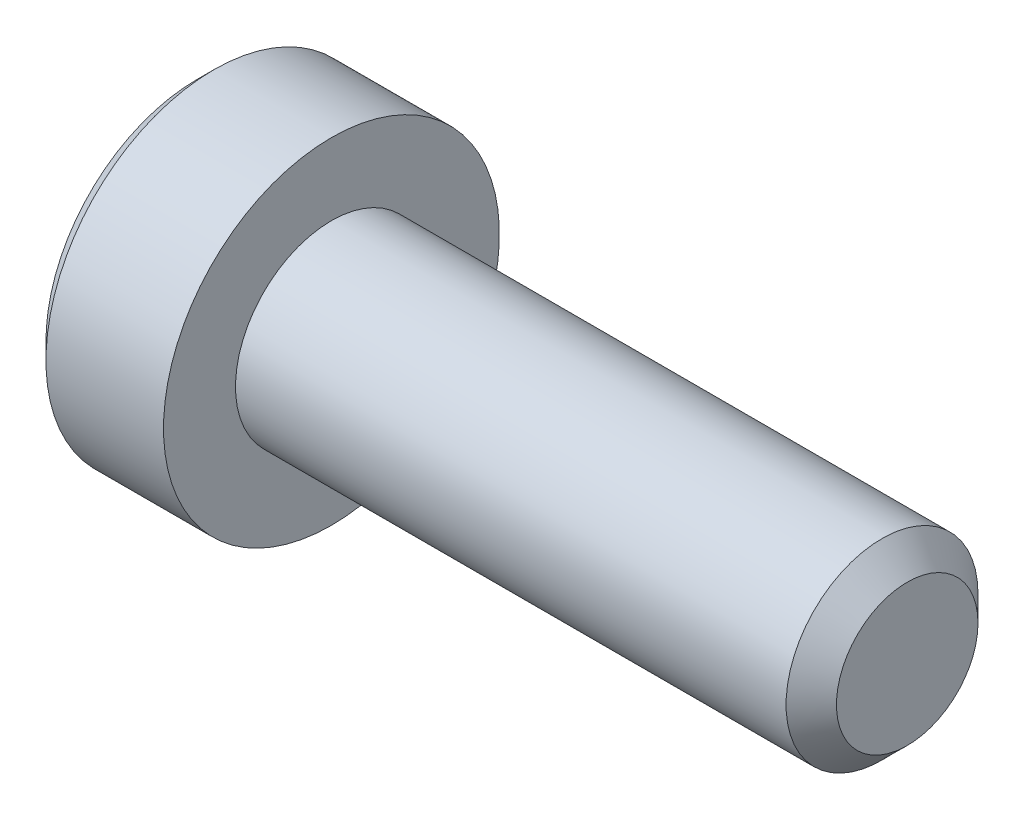
ISO-10303-21;
HEADER;
FILE_DESCRIPTION(('STEP AP214'),'2;1');
FILE_NAME('part.step','',(''),(''),'','','');
FILE_SCHEMA(('AUTOMOTIVE_DESIGN { 1 0 10303 214 1 1 1 1 }'));
ENDSEC;
DATA;
#1=APPLICATION_CONTEXT('core data for automotive mechanical design processes');
#2=APPLICATION_PROTOCOL_DEFINITION('international standard','automotive_design',2000,#1);
#3=PRODUCT_CONTEXT('',#1,'mechanical');
#4=PRODUCT('Part','Part','',(#3));
#5=PRODUCT_RELATED_PRODUCT_CATEGORY('part','',(#4));
#6=PRODUCT_DEFINITION_FORMATION('','',#4);
#7=PRODUCT_DEFINITION_CONTEXT('part definition',#1,'design');
#8=PRODUCT_DEFINITION('design','',#6,#7);
#9=PRODUCT_DEFINITION_SHAPE('','',#8);
#10=(LENGTH_UNIT() NAMED_UNIT(*) SI_UNIT(.MILLI.,.METRE.));
#11=(NAMED_UNIT(*) PLANE_ANGLE_UNIT() SI_UNIT($,.RADIAN.));
#12=(NAMED_UNIT(*) SI_UNIT($,.STERADIAN.) SOLID_ANGLE_UNIT());
#13=UNCERTAINTY_MEASURE_WITH_UNIT(LENGTH_MEASURE(1.E-05),#10,'distance_accuracy_value','');
#14=(GEOMETRIC_REPRESENTATION_CONTEXT(3) GLOBAL_UNCERTAINTY_ASSIGNED_CONTEXT((#13)) GLOBAL_UNIT_ASSIGNED_CONTEXT((#10,
#11,#12)) REPRESENTATION_CONTEXT('',''));
#15=CARTESIAN_POINT('',(0.,0.,0.));
#16=DIRECTION('',(0.,0.,1.));
#17=DIRECTION('',(1.,0.,0.));
#18=AXIS2_PLACEMENT_3D('',#15,#16,#17);
#19=CARTESIAN_POINT('',(-8.8,3.15,0.));
#20=DIRECTION('',(-1.,0.,0.));
#21=DIRECTION('',(0.,-1.,0.));
#22=AXIS2_PLACEMENT_3D('',#19,#20,#21);
#23=PLANE('',#22);
#24=CARTESIAN_POINT('',(-8.8,0.,0.));
#25=DIRECTION('',(-1.,0.,0.));
#26=DIRECTION('',(0.,-1.,0.));
#27=AXIS2_PLACEMENT_3D('',#24,#25,#26);
#28=CIRCLE('',#27,1.44337567297401);
#29=CARTESIAN_POINT('',(-8.80000000000001,-1.44337567297399,-1.28261117005035E-13));
#30=VERTEX_POINT('',#29);
#31=CARTESIAN_POINT('',(-8.80000000000001,-0.721687836487094,1.24999999999989));
#32=VERTEX_POINT('',#31);
#33=EDGE_CURVE('E138',#30,#32,#28,.T.);
#34=ORIENTED_EDGE('',*,*,#33,.F.);
#35=CARTESIAN_POINT('',(-8.8,-0.721687836487033,-1.25));
#36=VERTEX_POINT('',#35);
#37=EDGE_CURVE('E137',#36,#30,#28,.T.);
#38=ORIENTED_EDGE('',*,*,#37,.F.);
#39=CARTESIAN_POINT('',(-8.8,0.721687836486959,-1.25));
#40=VERTEX_POINT('',#39);
#41=EDGE_CURVE('E107',#40,#36,#28,.T.);
#42=ORIENTED_EDGE('',*,*,#41,.F.);
#43=CARTESIAN_POINT('',(-8.8,1.44337567297404,0.));
#44=VERTEX_POINT('',#43);
#45=EDGE_CURVE('E100',#44,#40,#28,.T.);
#46=ORIENTED_EDGE('',*,*,#45,.F.);
#47=CARTESIAN_POINT('',(-8.8,0.721687836486958,1.25));
#48=VERTEX_POINT('',#47);
#49=EDGE_CURVE('E61',#48,#44,#28,.T.);
#50=ORIENTED_EDGE('',*,*,#49,.F.);
#51=EDGE_CURVE('E68',#32,#48,#28,.T.);
#52=ORIENTED_EDGE('',*,*,#51,.F.);
#53=EDGE_LOOP('',(#34,#38,#42,#46,#50,#52));
#54=FACE_BOUND('',#53,.T.);
#55=CARTESIAN_POINT('',(-8.8,0.,0.));
#56=DIRECTION('',(1.,0.,0.));
#57=DIRECTION('',(0.,1.,0.));
#58=AXIS2_PLACEMENT_3D('',#55,#56,#57);
#59=CIRCLE('',#58,3.15);
#60=CARTESIAN_POINT('',(-8.8,3.15,0.));
#61=VERTEX_POINT('',#60);
#62=EDGE_CURVE('E227',#61,#61,#59,.T.);
#63=ORIENTED_EDGE('',*,*,#62,.F.);
#64=EDGE_LOOP('',(#63));
#65=FACE_BOUND('',#64,.T.);
#66=ADVANCED_FACE('F41',(#54,#65),#23,.T.);
#67=CARTESIAN_POINT('',(-6.,0.,0.));
#68=DIRECTION('',(1.,0.,0.));
#69=DIRECTION('',(0.,0.,-1.));
#70=AXIS2_PLACEMENT_3D('',#67,#68,#69);
#71=CYLINDRICAL_SURFACE('',#70,2.);
#72=CARTESIAN_POINT('',(5.475,0.,0.));
#73=DIRECTION('',(1.,0.,0.));
#74=DIRECTION('',(0.,0.,-1.));
#75=AXIS2_PLACEMENT_3D('',#72,#73,#74);
#76=CIRCLE('',#75,2.);
#77=CARTESIAN_POINT('',(5.475,0.,-2.));
#78=VERTEX_POINT('',#77);
#79=EDGE_CURVE('E55',#78,#78,#76,.F.);
#80=ORIENTED_EDGE('',*,*,#79,.T.);
#81=EDGE_LOOP('',(#80));
#82=FACE_BOUND('',#81,.T.);
#83=CARTESIAN_POINT('',(-6.,0.,0.));
#84=DIRECTION('',(1.,0.,0.));
#85=DIRECTION('',(0.,1.,0.));
#86=AXIS2_PLACEMENT_3D('',#83,#84,#85);
#87=CIRCLE('',#86,2.);
#88=CARTESIAN_POINT('',(-6.,1.99999999999999,0.));
#89=VERTEX_POINT('',#88);
#90=EDGE_CURVE('E220',#89,#89,#87,.F.);
#91=ORIENTED_EDGE('',*,*,#90,.F.);
#92=EDGE_LOOP('',(#91));
#93=FACE_BOUND('',#92,.T.);
#94=ADVANCED_FACE('F200',(#82,#93),#71,.T.);
#95=CARTESIAN_POINT('',(6.,0.,0.));
#96=DIRECTION('',(1.,0.,0.));
#97=DIRECTION('',(0.,0.,-1.));
#98=AXIS2_PLACEMENT_3D('',#95,#96,#97);
#99=PLANE('',#98);
#100=CARTESIAN_POINT('',(6.,0.,0.));
#101=DIRECTION('',(1.,0.,0.));
#102=DIRECTION('',(0.,0.,-1.));
#103=AXIS2_PLACEMENT_3D('',#100,#101,#102);
#104=CIRCLE('',#103,1.475);
#105=CARTESIAN_POINT('',(6.,0.,-1.475));
#106=VERTEX_POINT('',#105);
#107=EDGE_CURVE('E221',#106,#106,#104,.T.);
#108=ORIENTED_EDGE('',*,*,#107,.T.);
#109=EDGE_LOOP('',(#108));
#110=FACE_BOUND('',#109,.T.);
#111=ADVANCED_FACE('F208',(#110),#99,.T.);
#112=CARTESIAN_POINT('',(6.,0.,0.));
#113=DIRECTION('',(-1.,0.,0.));
#114=DIRECTION('',(0.,0.,1.));
#115=AXIS2_PLACEMENT_3D('',#112,#113,#114);
#116=CONICAL_SURFACE('',#115,1.475,0.785398163397447);
#117=ORIENTED_EDGE('',*,*,#79,.F.);
#118=EDGE_LOOP('',(#117));
#119=FACE_BOUND('',#118,.T.);
#120=ORIENTED_EDGE('',*,*,#107,.F.);
#121=EDGE_LOOP('',(#120));
#122=FACE_BOUND('',#121,.T.);
#123=ADVANCED_FACE('F43',(#119,#122),#116,.T.);
#124=CARTESIAN_POINT('',(-6.,0.,0.));
#125=DIRECTION('',(1.,0.,0.));
#126=DIRECTION('',(0.,1.,0.));
#127=AXIS2_PLACEMENT_3D('',#124,#125,#126);
#128=CYLINDRICAL_SURFACE('',#127,3.5);
#129=CARTESIAN_POINT('',(-8.45,0.,0.));
#130=DIRECTION('',(1.,0.,0.));
#131=DIRECTION('',(0.,1.,0.));
#132=AXIS2_PLACEMENT_3D('',#129,#130,#131);
#133=CIRCLE('',#132,3.5);
#134=CARTESIAN_POINT('',(-8.45,3.5,0.));
#135=VERTEX_POINT('',#134);
#136=EDGE_CURVE('E222',#135,#135,#133,.T.);
#137=ORIENTED_EDGE('',*,*,#136,.T.);
#138=EDGE_LOOP('',(#137));
#139=FACE_BOUND('',#138,.T.);
#140=CARTESIAN_POINT('',(-6.,0.,0.));
#141=DIRECTION('',(1.,0.,0.));
#142=DIRECTION('',(0.,1.,0.));
#143=AXIS2_PLACEMENT_3D('',#140,#141,#142);
#144=CIRCLE('',#143,3.5);
#145=CARTESIAN_POINT('',(-6.,3.5,0.));
#146=VERTEX_POINT('',#145);
#147=EDGE_CURVE('E232',#146,#146,#144,.T.);
#148=ORIENTED_EDGE('',*,*,#147,.F.);
#149=EDGE_LOOP('',(#148));
#150=FACE_BOUND('',#149,.T.);
#151=ADVANCED_FACE('F203',(#139,#150),#128,.T.);
#152=CARTESIAN_POINT('',(-8.45,0.,0.));
#153=DIRECTION('',(1.,0.,0.));
#154=DIRECTION('',(0.,1.,0.));
#155=AXIS2_PLACEMENT_3D('',#152,#153,#154);
#156=CONICAL_SURFACE('',#155,3.5,0.785398163397453);
#157=ORIENTED_EDGE('',*,*,#62,.T.);
#158=EDGE_LOOP('',(#157));
#159=FACE_BOUND('',#158,.T.);
#160=ORIENTED_EDGE('',*,*,#136,.F.);
#161=EDGE_LOOP('',(#160));
#162=FACE_BOUND('',#161,.T.);
#163=ADVANCED_FACE('F196',(#159,#162),#156,.T.);
#164=CARTESIAN_POINT('',(-6.,3.5,0.));
#165=DIRECTION('',(1.,0.,0.));
#166=DIRECTION('',(0.,1.,0.));
#167=AXIS2_PLACEMENT_3D('',#164,#165,#166);
#168=PLANE('',#167);
#169=ORIENTED_EDGE('',*,*,#90,.T.);
#170=EDGE_LOOP('',(#169));
#171=FACE_BOUND('',#170,.T.);
#172=ORIENTED_EDGE('',*,*,#147,.T.);
#173=EDGE_LOOP('',(#172));
#174=FACE_BOUND('',#173,.T.);
#175=ADVANCED_FACE('F160',(#171,#174),#168,.T.);
#176=CARTESIAN_POINT('',(-8.8,0.,0.));
#177=DIRECTION('',(-1.,0.,0.));
#178=DIRECTION('',(0.,-1.,0.));
#179=AXIS2_PLACEMENT_3D('',#176,#177,#178);
#180=CONICAL_SURFACE('',#179,1.44337567297401,0.78539816339745);
#181=CARTESIAN_POINT('',(-9.2629820970505,-1.43934010829017,-1.25));
#182=CARTESIAN_POINT('',(-9.23652492278497,-1.40429313026011,-1.25));
#183=CARTESIAN_POINT('',(-9.21032716050029,-1.36905087155362,-1.25));
#184=CARTESIAN_POINT('',(-9.15855757197346,-1.29809650724889,-1.25));
#185=CARTESIAN_POINT('',(-9.13298590448413,-1.26238428594478,-1.25));
#186=CARTESIAN_POINT('',(-9.05700599379905,-1.15390111808868,-1.25));
#187=CARTESIAN_POINT('',(-9.00774028628704,-1.08031646741186,-1.25));
#188=CARTESIAN_POINT('',(-8.91102583033568,-0.926012322877283,-1.25));
#189=CARTESIAN_POINT('',(-8.86384129900163,-0.845125318763629,-1.25));
#190=CARTESIAN_POINT('',(-8.77753073442667,-0.679311174153423,-1.25));
#191=CARTESIAN_POINT('',(-8.73837753465229,-0.594398891087563,-1.25));
#192=CARTESIAN_POINT('',(-8.69047722370561,-0.466944812509618,-1.25));
#193=CARTESIAN_POINT('',(-8.67672948980397,-0.426289985866723,-1.25));
#194=CARTESIAN_POINT('',(-8.65249792746778,-0.343998850155381,-1.25));
#195=CARTESIAN_POINT('',(-8.64201432388631,-0.302362473684265,-1.25));
#196=CARTESIAN_POINT('',(-8.62503016176226,-0.219052696365173,-1.25));
#197=CARTESIAN_POINT('',(-8.61846136048348,-0.177393428559023,-1.25));
#198=CARTESIAN_POINT('',(-8.60943505346504,-0.0936293694345762,-1.25));
#199=CARTESIAN_POINT('',(-8.60697684100157,-0.051524655953627,-1.25));
#200=CARTESIAN_POINT('',(-8.60635406201078,0.0311890575224607,-1.25));
#201=CARTESIAN_POINT('',(-8.60803711683997,0.0717969624376541,-1.25));
#202=CARTESIAN_POINT('',(-8.61526827058351,0.152668636765115,-1.25));
#203=CARTESIAN_POINT('',(-8.62081711039435,0.192932338711576,-1.25));
#204=CARTESIAN_POINT('',(-8.63557103643706,0.273499879034211,-1.25));
#205=CARTESIAN_POINT('',(-8.64483817593141,0.313792180483837,-1.25));
#206=CARTESIAN_POINT('',(-8.66653617841495,0.393496413769948,-1.25));
#207=CARTESIAN_POINT('',(-8.67896677668333,0.432908418970306,-1.25));
#208=CARTESIAN_POINT('',(-8.72277935286099,0.556992735686021,-1.25));
#209=CARTESIAN_POINT('',(-8.75915107278422,0.639898924463107,-1.25));
#210=CARTESIAN_POINT('',(-8.84001916204168,0.801816555245372,-1.25));
#211=CARTESIAN_POINT('',(-8.88454472075169,0.880812666046076,-1.25));
#212=CARTESIAN_POINT('',(-8.97640487646107,1.03178561247423,-1.25));
#213=CARTESIAN_POINT('',(-9.02348993368928,1.10391618450778,-1.25));
#214=CARTESIAN_POINT('',(-9.09627856133957,1.21018606006072,-1.25));
#215=CARTESIAN_POINT('',(-9.12079808512381,1.24515069931179,-1.25));
#216=CARTESIAN_POINT('',(-9.17048563647498,1.31460220812617,-1.25));
#217=CARTESIAN_POINT('',(-9.19565348511425,1.34908920555542,-1.25));
#218=CARTESIAN_POINT('',(-9.22109014852939,1.38337731640881,-1.25));
#219=B_SPLINE_CURVE_WITH_KNOTS('',3,(#181,#182,#183,#184,#185,#186,#187,#188,#189,#190,#191,
#192,#193,#194,#195,#196,#197,#198,#199,#200,#201,#202,#203,#204,#205,#206,#207,#208,#209,#210,
#211,#212,#213,#214,#215,#216,#217,#218),.UNSPECIFIED.,.F.,.F.,(4,2,2,2,2,2,2,2,2,2,2,2,2,2,2,2,
2,2,4),(0.,0.131732960406522,0.263498984211801,0.529042014557083,0.809741926293181,
1.08947609738758,1.21811634292656,1.3467654480253,1.47310084535082,1.59941451989632,
1.72115042182424,1.84290966145035,1.96679153917269,2.09066305376596,2.36146692896708,
2.63325989189267,2.89154668194566,3.01965734485812,3.1477330221954),.UNSPECIFIED.);
#220=EDGE_CURVE('E11',#36,#40,#219,.T.);
#221=ORIENTED_EDGE('',*,*,#220,.T.);
#222=ORIENTED_EDGE('',*,*,#41,.T.);
#223=EDGE_LOOP('',(#221,#222));
#224=FACE_BOUND('',#223,.T.);
#225=ADVANCED_FACE('F112',(#224),#180,.F.);
#226=CARTESIAN_POINT('',(-8.80011548390922,-1.4434911430279,0.000200000000000386));
#227=CARTESIAN_POINT('',(-8.77532166805519,-1.41867941875065,-0.0427751670715869));
#228=CARTESIAN_POINT('',(-8.75198373441876,-1.39345276980743,-0.0864690047459489));
#229=CARTESIAN_POINT('',(-8.70925200408462,-1.34201263554194,-0.175565930841944));
#230=CARTESIAN_POINT('',(-8.68988199236049,-1.31579425481276,-0.220977498357066));
#231=CARTESIAN_POINT('',(-8.65670048341356,-1.26292610442246,-0.312547820935263));
#232=CARTESIAN_POINT('',(-8.64280555905273,-1.23628980770471,-0.35868324017589));
#233=CARTESIAN_POINT('',(-8.62139728216072,-1.18243062538508,-0.451970080407598));
#234=CARTESIAN_POINT('',(-8.61386794156686,-1.15520938653761,-0.499118649136386));
#235=CARTESIAN_POINT('',(-8.60707449805078,-1.10829684367466,-0.58037355688726));
#236=CARTESIAN_POINT('',(-8.60606855910443,-1.08866617256958,-0.614374876627949));
#237=CARTESIAN_POINT('',(-8.6077614149114,-1.0494393280061,-0.682317764432487));
#238=CARTESIAN_POINT('',(-8.61046102721562,-1.02984316311599,-0.716259317655667));
#239=CARTESIAN_POINT('',(-8.61940893031645,-0.990839954603494,-0.78381485645751));
#240=CARTESIAN_POINT('',(-8.62566052589978,-0.971433104248765,-0.817428507286786));
#241=CARTESIAN_POINT('',(-8.64137568141398,-0.932943395609899,-0.884094638217825));
#242=CARTESIAN_POINT('',(-8.65084062008754,-0.913860680098293,-0.917146871030308));
#243=CARTESIAN_POINT('',(-8.67893139068766,-0.864986351354562,-1.00179969160028));
#244=CARTESIAN_POINT('',(-8.69967015745227,-0.835502920149071,-1.05286649242965));
#245=CARTESIAN_POINT('',(-8.74638713467155,-0.777690319475906,-1.15300085411326));
#246=CARTESIAN_POINT('',(-8.77234829594684,-0.749357745598416,-1.20207431157827));
#247=CARTESIAN_POINT('',(-8.8001154839092,-0.721572366433195,-1.2502));
#248=B_SPLINE_CURVE_WITH_KNOTS('',3,(#226,#227,#228,#229,#230,#231,#232,#233,#234,#235,#236,
#237,#238,#239,#240,#241,#242,#243,#244,#245,#246,#247),.UNSPECIFIED.,.F.,.F.,(4,2,2,2,2,2,2,2,
2,2,4),(0.,0.166533409618306,0.334037607289766,0.498880396489705,0.663307919240284,
0.780963963458838,0.898645970148466,1.01643764860775,1.13427993171551,1.32148652032142,
1.50809158792573),.UNSPECIFIED.);
#249=EDGE_CURVE('E140',#30,#36,#248,.T.);
#250=ORIENTED_EDGE('',*,*,#249,.T.);
#251=ORIENTED_EDGE('',*,*,#37,.T.);
#252=EDGE_LOOP('',(#250,#251));
#253=FACE_BOUND('',#252,.T.);
#254=ADVANCED_FACE('F159',(#253),#180,.F.);
#255=CARTESIAN_POINT('',(-8.8001154839092,-0.721572366433195,1.2502));
#256=CARTESIAN_POINT('',(-8.77532166805517,-0.746384090710444,1.20722483292841));
#257=CARTESIAN_POINT('',(-8.75198373441875,-0.771610739653664,1.16353099525405));
#258=CARTESIAN_POINT('',(-8.70925200408461,-0.823050873919153,1.07443406915806));
#259=CARTESIAN_POINT('',(-8.68988199236049,-0.849269254648332,1.02902250164294));
#260=CARTESIAN_POINT('',(-8.65670048341355,-0.902137405038633,0.937452179064745));
#261=CARTESIAN_POINT('',(-8.64280555905273,-0.928773701756384,0.89131675982412));
#262=CARTESIAN_POINT('',(-8.62139728216071,-0.982632884076008,0.798029919592415));
#263=CARTESIAN_POINT('',(-8.61386794156686,-1.00985412292348,0.750881350863629));
#264=CARTESIAN_POINT('',(-8.60707449805078,-1.05676666578642,0.669626443112757));
#265=CARTESIAN_POINT('',(-8.60606855910443,-1.07639733689151,0.635625123372068));
#266=CARTESIAN_POINT('',(-8.6077614149114,-1.11562418145498,0.567682235567531));
#267=CARTESIAN_POINT('',(-8.61046102721562,-1.1352203463451,0.53374068234435));
#268=CARTESIAN_POINT('',(-8.61940893031646,-1.17422355485759,0.466185143542507));
#269=CARTESIAN_POINT('',(-8.62566052589978,-1.19363040521232,0.432571492713232));
#270=CARTESIAN_POINT('',(-8.64137568141398,-1.23212011385119,0.365905361782193));
#271=CARTESIAN_POINT('',(-8.65084062008754,-1.25120282936279,0.33285312896971));
#272=CARTESIAN_POINT('',(-8.67893139068767,-1.30007715810653,0.24820030839974));
#273=CARTESIAN_POINT('',(-8.69967015745228,-1.32956058931202,0.197133507570365));
#274=CARTESIAN_POINT('',(-8.74638713467156,-1.38737318998519,0.0969991458867467));
#275=CARTESIAN_POINT('',(-8.77234829594685,-1.41570576386268,0.0479256884217313));
#276=CARTESIAN_POINT('',(-8.80011548390922,-1.4434911430279,-0.000199999999999527));
#277=B_SPLINE_CURVE_WITH_KNOTS('',3,(#255,#256,#257,#258,#259,#260,#261,#262,#263,#264,#265,
#266,#267,#268,#269,#270,#271,#272,#273,#274,#275,#276),.UNSPECIFIED.,.F.,.F.,(4,2,2,2,2,2,2,2,
2,2,4),(0.,0.1665334096183,0.334037607289755,0.498880396489688,0.66330791924026,
0.780963963458814,0.898645970148441,1.01643764860772,1.13427993171549,1.3214865203214,
1.50809158792573),.UNSPECIFIED.);
#278=EDGE_CURVE('E147',#32,#30,#277,.T.);
#279=ORIENTED_EDGE('',*,*,#278,.T.);
#280=ORIENTED_EDGE('',*,*,#33,.T.);
#281=EDGE_LOOP('',(#279,#280));
#282=FACE_BOUND('',#281,.T.);
#283=ADVANCED_FACE('F265',(#282),#180,.F.);
#284=CARTESIAN_POINT('',(-9.26298209689239,-1.43934010808075,1.25));
#285=CARTESIAN_POINT('',(-9.23652492263295,-1.40429313005657,1.25));
#286=CARTESIAN_POINT('',(-9.21032716035434,-1.36905087135597,1.25));
#287=CARTESIAN_POINT('',(-9.15855757183964,-1.29809650706309,1.25));
#288=CARTESIAN_POINT('',(-9.13298590435635,-1.26238428576493,1.25));
#289=CARTESIAN_POINT('',(-9.05700599368952,-1.15390111792706,1.25));
#290=CARTESIAN_POINT('',(-9.00774028618962,-1.08031646726262,1.25));
#291=CARTESIAN_POINT('',(-8.91102583026319,-0.926012322755074,1.25));
#292=CARTESIAN_POINT('',(-8.86384129894185,-0.845125318656125,1.25));
#293=CARTESIAN_POINT('',(-8.77753073439047,-0.679311174076581,1.25));
#294=CARTESIAN_POINT('',(-8.73837753462696,-0.594398891026666,1.25));
#295=CARTESIAN_POINT('',(-8.69047722368835,-0.466944812460719,1.25));
#296=CARTESIAN_POINT('',(-8.67672948978639,-0.4262899858128,1.25));
#297=CARTESIAN_POINT('',(-8.6524979274506,-0.343998850091245,1.25));
#298=CARTESIAN_POINT('',(-8.64201432386983,-0.30236247361494,1.25));
#299=CARTESIAN_POINT('',(-8.62503016174835,-0.219052696285643,1.25));
#300=CARTESIAN_POINT('',(-8.61846136047142,-0.177393428474478,1.25));
#301=CARTESIAN_POINT('',(-8.60943505345781,-0.0936293693401696,1.25));
#302=CARTESIAN_POINT('',(-8.60697684099732,-0.0515246558543735,1.25));
#303=CARTESIAN_POINT('',(-8.60635406201334,0.0311890576306543,1.25));
#304=CARTESIAN_POINT('',(-8.6080371168463,0.0717969625499533,1.25));
#305=CARTESIAN_POINT('',(-8.61526827059796,0.15266863688522,1.25));
#306=CARTESIAN_POINT('',(-8.62081711041316,0.192932338835381,1.25));
#307=CARTESIAN_POINT('',(-8.63557103646501,0.273499879165318,1.25));
#308=CARTESIAN_POINT('',(-8.64483817596416,0.313792180618534,1.25));
#309=CARTESIAN_POINT('',(-8.6665361784574,0.393496413911481,1.25));
#310=CARTESIAN_POINT('',(-8.67896677673069,0.432908419115082,1.25));
#311=CARTESIAN_POINT('',(-8.72277935293149,0.556992735862321,1.25));
#312=CARTESIAN_POINT('',(-8.759151072876,0.639898924666109,1.25));
#313=CARTESIAN_POINT('',(-8.84001916217838,0.801816555499724,1.25));
#314=CARTESIAN_POINT('',(-8.88454472091203,0.880812666325067,1.25));
#315=CARTESIAN_POINT('',(-8.97640487666667,1.03178561279752,1.25));
#316=CARTESIAN_POINT('',(-9.0234899339163,1.10391618485088,1.25));
#317=CARTESIAN_POINT('',(-9.09627856159859,1.21018606043313,1.25));
#318=CARTESIAN_POINT('',(-9.12079808539341,1.24515069969382,1.25));
#319=CARTESIAN_POINT('',(-9.17048563676573,1.31460220852739,1.25));
#320=CARTESIAN_POINT('',(-9.19565348541557,1.3490892059662,1.25));
#321=CARTESIAN_POINT('',(-9.22109014884126,1.38337731682914,1.25));
#322=B_SPLINE_CURVE_WITH_KNOTS('',3,(#284,#285,#286,#287,#288,#289,#290,#291,#292,#293,#294,
#295,#296,#297,#298,#299,#300,#301,#302,#303,#304,#305,#306,#307,#308,#309,#310,#311,#312,#313,
#314,#315,#316,#317,#318,#319,#320,#321),.UNSPECIFIED.,.F.,.F.,(4,2,2,2,2,2,2,2,2,2,2,2,2,2,2,2,
2,2,4),(0.,0.13173296038145,0.263498984161648,0.52904201445583,0.809741926134624,
1.08947609717226,1.21811634272577,1.34676544783901,1.47310084517845,1.59941451973785,
1.7211504216785,1.84290966131736,1.96679153905342,2.0906630536604,2.3614669289601,
2.63325989198492,2.8915466821228,3.01965734507713,3.14773302245629),.UNSPECIFIED.);
#323=EDGE_CURVE('E167',#48,#32,#322,.F.);
#324=ORIENTED_EDGE('',*,*,#323,.T.);
#325=ORIENTED_EDGE('',*,*,#51,.T.);
#326=EDGE_LOOP('',(#324,#325));
#327=FACE_BOUND('',#326,.T.);
#328=ADVANCED_FACE('F281',(#327),#180,.F.);
#329=CARTESIAN_POINT('',(-8.80011548390916,1.4434911430279,-0.000200000000000162));
#330=CARTESIAN_POINT('',(-8.77532166805513,1.41867941875065,0.042775167071586));
#331=CARTESIAN_POINT('',(-8.75198373441871,1.39345276980743,0.0864690047459467));
#332=CARTESIAN_POINT('',(-8.70925200408456,1.34201263554194,0.175565930841939));
#333=CARTESIAN_POINT('',(-8.68988199236044,1.31579425481277,0.22097749835706));
#334=CARTESIAN_POINT('',(-8.65670048341351,1.26292610442246,0.312547820935254));
#335=CARTESIAN_POINT('',(-8.64280555905268,1.23628980770471,0.35868324017588));
#336=CARTESIAN_POINT('',(-8.62139728216067,1.18243062538509,0.451970080407585));
#337=CARTESIAN_POINT('',(-8.61386794156682,1.15520938653762,0.499118649136372));
#338=CARTESIAN_POINT('',(-8.60707449805073,1.10829684367467,0.580373556887243));
#339=CARTESIAN_POINT('',(-8.60606855910438,1.08866617256959,0.614374876627931));
#340=CARTESIAN_POINT('',(-8.60776141491135,1.04943932800612,0.682317764432467));
#341=CARTESIAN_POINT('',(-8.61046102721557,1.029843163116,0.716259317655646));
#342=CARTESIAN_POINT('',(-8.61940893031641,0.990839954603507,0.783814856457487));
#343=CARTESIAN_POINT('',(-8.62566052589974,0.971433104248779,0.817428507286762));
#344=CARTESIAN_POINT('',(-8.64137568141393,0.932943395609914,0.884094638217799));
#345=CARTESIAN_POINT('',(-8.65084062008749,0.913860680098309,0.917146871030281));
#346=CARTESIAN_POINT('',(-8.67893139068762,0.864986351354575,1.00179969160025));
#347=CARTESIAN_POINT('',(-8.69967015745223,0.835502920149082,1.05286649242963));
#348=CARTESIAN_POINT('',(-8.74638713467151,0.777690319475912,1.15300085411325));
#349=CARTESIAN_POINT('',(-8.7723482959468,0.749357745598419,1.20207431157827));
#350=CARTESIAN_POINT('',(-8.80011548390918,0.721572366433195,1.2502));
#351=B_SPLINE_CURVE_WITH_KNOTS('',3,(#329,#330,#331,#332,#333,#334,#335,#336,#337,#338,#339,
#340,#341,#342,#343,#344,#345,#346,#347,#348,#349,#350),.UNSPECIFIED.,.F.,.F.,(4,2,2,2,2,2,2,2,
2,2,4),(0.,0.166533409618301,0.334037607289756,0.49888039648969,0.663307919240264,
0.780963963458814,0.898645970148439,1.01643764860772,1.13427993171548,1.3214865203214,
1.50809158792574),.UNSPECIFIED.);
#352=EDGE_CURVE('E127',#44,#48,#351,.T.);
#353=ORIENTED_EDGE('',*,*,#352,.T.);
#354=ORIENTED_EDGE('',*,*,#49,.T.);
#355=EDGE_LOOP('',(#353,#354));
#356=FACE_BOUND('',#355,.T.);
#357=ADVANCED_FACE('F257',(#356),#180,.F.);
#358=CARTESIAN_POINT('',(-8.80011548390918,0.721572366433195,-1.2502));
#359=CARTESIAN_POINT('',(-8.77532166805514,0.746384090710445,-1.20722483292841));
#360=CARTESIAN_POINT('',(-8.75198373441872,0.771610739653666,-1.16353099525405));
#361=CARTESIAN_POINT('',(-8.70925200408457,0.823050873919157,-1.07443406915805));
#362=CARTESIAN_POINT('',(-8.68988199236045,0.849269254648336,-1.02902250164293));
#363=CARTESIAN_POINT('',(-8.65670048341351,0.902137405038639,-0.937452179064735));
#364=CARTESIAN_POINT('',(-8.64280555905269,0.928773701756391,-0.891316759824109));
#365=CARTESIAN_POINT('',(-8.62139728216067,0.982632884076017,-0.7980299195924));
#366=CARTESIAN_POINT('',(-8.61386794156682,1.00985412292349,-0.750881350863612));
#367=CARTESIAN_POINT('',(-8.60707449805073,1.05676666578643,-0.669626443112739));
#368=CARTESIAN_POINT('',(-8.60606855910438,1.07639733689152,-0.635625123372051));
#369=CARTESIAN_POINT('',(-8.60776141491135,1.11562418145499,-0.567682235567515));
#370=CARTESIAN_POINT('',(-8.61046102721557,1.13522034634511,-0.533740682344335));
#371=CARTESIAN_POINT('',(-8.61940893031641,1.1742235548576,-0.466185143542494));
#372=CARTESIAN_POINT('',(-8.62566052589974,1.19363040521233,-0.432571492713219));
#373=CARTESIAN_POINT('',(-8.64137568141393,1.23212011385119,-0.365905361782182));
#374=CARTESIAN_POINT('',(-8.65084062008749,1.2512028293628,-0.3328531289697));
#375=CARTESIAN_POINT('',(-8.67893139068761,1.30007715810653,-0.248200308399732));
#376=CARTESIAN_POINT('',(-8.69967015745223,1.32956058931202,-0.197133507570359));
#377=CARTESIAN_POINT('',(-8.7463871346715,1.38737318998519,-0.0969991458867438));
#378=CARTESIAN_POINT('',(-8.77234829594679,1.41570576386268,-0.0479256884217298));
#379=CARTESIAN_POINT('',(-8.80011548390916,1.4434911430279,0.000200000000000091));
#380=B_SPLINE_CURVE_WITH_KNOTS('',3,(#358,#359,#360,#361,#362,#363,#364,#365,#366,#367,#368,
#369,#370,#371,#372,#373,#374,#375,#376,#377,#378,#379),.UNSPECIFIED.,.F.,.F.,(4,2,2,2,2,2,2,2,
2,2,4),(0.,0.166533409618307,0.334037607289768,0.498880396489707,0.663307919240286,
0.780963963458837,0.898645970148462,1.01643764860774,1.1342799317155,1.32148652032141,
1.50809158792574),.UNSPECIFIED.);
#381=EDGE_CURVE('E103',#40,#44,#380,.T.);
#382=ORIENTED_EDGE('',*,*,#381,.T.);
#383=ORIENTED_EDGE('',*,*,#45,.T.);
#384=EDGE_LOOP('',(#382,#383));
#385=FACE_BOUND('',#384,.T.);
#386=ADVANCED_FACE('F101',(#385),#180,.F.);
#387=CARTESIAN_POINT('',(-6.38,1.44337567297406,0.));
#388=DIRECTION('',(1.,0.,0.));
#389=DIRECTION('',(0.,0.,-1.));
#390=AXIS2_PLACEMENT_3D('',#387,#388,#389);
#391=PLANE('',#390);
#392=DIRECTION('',(0.,0.5,0.866025403784439));
#393=VECTOR('',#392,1.);
#394=CARTESIAN_POINT('',(-6.38,0.721687836487033,-1.25));
#395=LINE('',#394,#393);
#396=CARTESIAN_POINT('',(-6.38,0.721687836487033,-1.25));
#397=VERTEX_POINT('',#396);
#398=CARTESIAN_POINT('',(-6.38,1.44337567297406,0.));
#399=VERTEX_POINT('',#398);
#400=EDGE_CURVE('E126',#397,#399,#395,.T.);
#401=ORIENTED_EDGE('',*,*,#400,.F.);
#402=DIRECTION('',(0.,1.,0.));
#403=VECTOR('',#402,1.);
#404=CARTESIAN_POINT('',(-6.38,-0.721687836487033,-1.25));
#405=LINE('',#404,#403);
#406=CARTESIAN_POINT('',(-6.38,-0.721687836487033,-1.25));
#407=VERTEX_POINT('',#406);
#408=EDGE_CURVE('E131',#407,#397,#405,.T.);
#409=ORIENTED_EDGE('',*,*,#408,.F.);
#410=DIRECTION('',(0.,0.5,-0.866025403784439));
#411=VECTOR('',#410,1.);
#412=CARTESIAN_POINT('',(-6.38,-1.44337567297406,0.));
#413=LINE('',#412,#411);
#414=CARTESIAN_POINT('',(-6.38,-1.44337567297406,0.));
#415=VERTEX_POINT('',#414);
#416=EDGE_CURVE('E247',#415,#407,#413,.T.);
#417=ORIENTED_EDGE('',*,*,#416,.F.);
#418=DIRECTION('',(0.,-0.5,-0.866025403784438));
#419=VECTOR('',#418,1.);
#420=CARTESIAN_POINT('',(-6.38,-0.721687836487033,1.25));
#421=LINE('',#420,#419);
#422=CARTESIAN_POINT('',(-6.38,-0.721687836487033,1.25));
#423=VERTEX_POINT('',#422);
#424=EDGE_CURVE('E249',#423,#415,#421,.T.);
#425=ORIENTED_EDGE('',*,*,#424,.F.);
#426=DIRECTION('',(0.,-1.,0.));
#427=VECTOR('',#426,1.);
#428=CARTESIAN_POINT('',(-6.38,0.721687836487033,1.25));
#429=LINE('',#428,#427);
#430=CARTESIAN_POINT('',(-6.38,0.721687836487033,1.25));
#431=VERTEX_POINT('',#430);
#432=EDGE_CURVE('E251',#431,#423,#429,.T.);
#433=ORIENTED_EDGE('',*,*,#432,.F.);
#434=DIRECTION('',(0.,-0.5,0.866025403784439));
#435=VECTOR('',#434,1.);
#436=CARTESIAN_POINT('',(-6.38,1.44337567297406,0.));
#437=LINE('',#436,#435);
#438=EDGE_CURVE('E253',#399,#431,#437,.T.);
#439=ORIENTED_EDGE('',*,*,#438,.F.);
#440=EDGE_LOOP('',(#401,#409,#417,#425,#433,#439));
#441=FACE_BOUND('',#440,.T.);
#442=ADVANCED_FACE('F161',(#441),#391,.F.);
#443=CARTESIAN_POINT('',(-6.38,-0.721687836487033,-1.25));
#444=DIRECTION('',(0.,0.,1.));
#445=DIRECTION('',(0.,-1.,0.));
#446=AXIS2_PLACEMENT_3D('',#443,#444,#445);
#447=PLANE('',#446);
#448=ORIENTED_EDGE('',*,*,#220,.F.);
#449=DIRECTION('',(-1.,0.,0.));
#450=VECTOR('',#449,1.);
#451=CARTESIAN_POINT('',(-6.38,-0.721687836487033,-1.25));
#452=LINE('',#451,#450);
#453=EDGE_CURVE('E132',#407,#36,#452,.T.);
#454=ORIENTED_EDGE('',*,*,#453,.F.);
#455=ORIENTED_EDGE('',*,*,#408,.T.);
#456=DIRECTION('',(-1.,0.,0.));
#457=VECTOR('',#456,1.);
#458=CARTESIAN_POINT('',(-6.38,0.721687836487033,-1.25));
#459=LINE('',#458,#457);
#460=EDGE_CURVE('E122',#397,#40,#459,.T.);
#461=ORIENTED_EDGE('',*,*,#460,.T.);
#462=EDGE_LOOP('',(#448,#454,#455,#461));
#463=FACE_BOUND('',#462,.T.);
#464=ADVANCED_FACE('F129',(#463),#447,.T.);
#465=CARTESIAN_POINT('',(-6.38,-1.44337567297406,0.));
#466=DIRECTION('',(0.,0.866025403784439,0.5));
#467=DIRECTION('',(0.,-0.5,0.866025403784439));
#468=AXIS2_PLACEMENT_3D('',#465,#466,#467);
#469=PLANE('',#468);
#470=ORIENTED_EDGE('',*,*,#249,.F.);
#471=DIRECTION('',(-1.,0.,0.));
#472=VECTOR('',#471,1.);
#473=CARTESIAN_POINT('',(-6.38,-1.44337567297406,0.));
#474=LINE('',#473,#472);
#475=EDGE_CURVE('E242',#415,#30,#474,.T.);
#476=ORIENTED_EDGE('',*,*,#475,.F.);
#477=ORIENTED_EDGE('',*,*,#416,.T.);
#478=ORIENTED_EDGE('',*,*,#453,.T.);
#479=EDGE_LOOP('',(#470,#476,#477,#478));
#480=FACE_BOUND('',#479,.T.);
#481=ADVANCED_FACE('F154',(#480),#469,.T.);
#482=CARTESIAN_POINT('',(-6.38,-0.721687836487033,1.25));
#483=DIRECTION('',(0.,0.866025403784438,-0.5));
#484=DIRECTION('',(0.,0.5,0.866025403784439));
#485=AXIS2_PLACEMENT_3D('',#482,#483,#484);
#486=PLANE('',#485);
#487=ORIENTED_EDGE('',*,*,#278,.F.);
#488=DIRECTION('',(-1.,0.,0.));
#489=VECTOR('',#488,1.);
#490=CARTESIAN_POINT('',(-6.38,-0.721687836487033,1.25));
#491=LINE('',#490,#489);
#492=EDGE_CURVE('E239',#423,#32,#491,.T.);
#493=ORIENTED_EDGE('',*,*,#492,.F.);
#494=ORIENTED_EDGE('',*,*,#424,.T.);
#495=ORIENTED_EDGE('',*,*,#475,.T.);
#496=EDGE_LOOP('',(#487,#493,#494,#495));
#497=FACE_BOUND('',#496,.T.);
#498=ADVANCED_FACE('F271',(#497),#486,.T.);
#499=CARTESIAN_POINT('',(-6.38,0.721687836487033,1.25));
#500=DIRECTION('',(0.,0.,-1.));
#501=DIRECTION('',(0.,1.,0.));
#502=AXIS2_PLACEMENT_3D('',#499,#500,#501);
#503=PLANE('',#502);
#504=ORIENTED_EDGE('',*,*,#323,.F.);
#505=DIRECTION('',(-1.,0.,0.));
#506=VECTOR('',#505,1.);
#507=CARTESIAN_POINT('',(-6.38,0.721687836487033,1.25));
#508=LINE('',#507,#506);
#509=EDGE_CURVE('E236',#431,#48,#508,.T.);
#510=ORIENTED_EDGE('',*,*,#509,.F.);
#511=ORIENTED_EDGE('',*,*,#432,.T.);
#512=ORIENTED_EDGE('',*,*,#492,.T.);
#513=EDGE_LOOP('',(#504,#510,#511,#512));
#514=FACE_BOUND('',#513,.T.);
#515=ADVANCED_FACE('F188',(#514),#503,.T.);
#516=CARTESIAN_POINT('',(-6.38,1.44337567297406,0.));
#517=DIRECTION('',(0.,-0.866025403784439,-0.5));
#518=DIRECTION('',(0.,0.5,-0.866025403784439));
#519=AXIS2_PLACEMENT_3D('',#516,#517,#518);
#520=PLANE('',#519);
#521=ORIENTED_EDGE('',*,*,#352,.F.);
#522=DIRECTION('',(-1.,0.,0.));
#523=VECTOR('',#522,1.);
#524=CARTESIAN_POINT('',(-6.38,1.44337567297406,0.));
#525=LINE('',#524,#523);
#526=EDGE_CURVE('E125',#399,#44,#525,.T.);
#527=ORIENTED_EDGE('',*,*,#526,.F.);
#528=ORIENTED_EDGE('',*,*,#438,.T.);
#529=ORIENTED_EDGE('',*,*,#509,.T.);
#530=EDGE_LOOP('',(#521,#527,#528,#529));
#531=FACE_BOUND('',#530,.T.);
#532=ADVANCED_FACE('F185',(#531),#520,.T.);
#533=CARTESIAN_POINT('',(-6.38,0.721687836487033,-1.25));
#534=DIRECTION('',(0.,-0.866025403784439,0.5));
#535=DIRECTION('',(0.,-0.5,-0.866025403784439));
#536=AXIS2_PLACEMENT_3D('',#533,#534,#535);
#537=PLANE('',#536);
#538=ORIENTED_EDGE('',*,*,#381,.F.);
#539=ORIENTED_EDGE('',*,*,#460,.F.);
#540=ORIENTED_EDGE('',*,*,#400,.T.);
#541=ORIENTED_EDGE('',*,*,#526,.T.);
#542=EDGE_LOOP('',(#538,#539,#540,#541));
#543=FACE_BOUND('',#542,.T.);
#544=ADVANCED_FACE('F120',(#543),#537,.T.);
#545=CLOSED_SHELL('',(#66,#94,#111,#123,#151,#163,#175,#225,#254,#283,#328,#357,#386,#442,#464,
#481,#498,#515,#532,#544));
#546=MANIFOLD_SOLID_BREP('B2',#545);
#547=ADVANCED_BREP_SHAPE_REPRESENTATION('',(#18,#546),#14);
#548=SHAPE_DEFINITION_REPRESENTATION(#9,#547);
ENDSEC;
END-ISO-10303-21;
